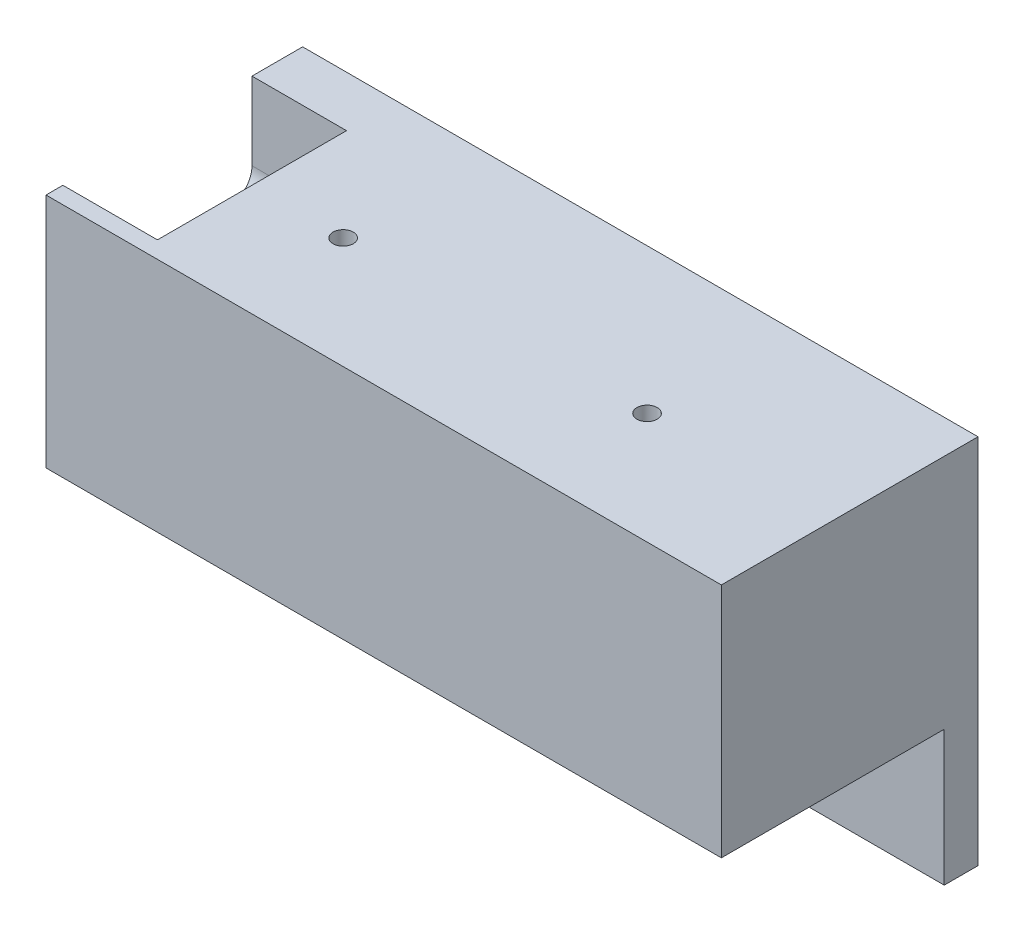
ISO-10303-21;
HEADER;
FILE_DESCRIPTION(('STEP AP214'),'2;1');
FILE_NAME('part.step','',(''),(''),'','','');
FILE_SCHEMA(('AUTOMOTIVE_DESIGN { 1 0 10303 214 1 1 1 1 }'));
ENDSEC;
DATA;
#1=APPLICATION_CONTEXT('core data for automotive mechanical design processes');
#2=APPLICATION_PROTOCOL_DEFINITION('international standard','automotive_design',2000,#1);
#3=PRODUCT_CONTEXT('',#1,'mechanical');
#4=PRODUCT('Part','Part','',(#3));
#5=PRODUCT_RELATED_PRODUCT_CATEGORY('part','',(#4));
#6=PRODUCT_DEFINITION_FORMATION('','',#4);
#7=PRODUCT_DEFINITION_CONTEXT('part definition',#1,'design');
#8=PRODUCT_DEFINITION('design','',#6,#7);
#9=PRODUCT_DEFINITION_SHAPE('','',#8);
#10=(LENGTH_UNIT() NAMED_UNIT(*) SI_UNIT(.MILLI.,.METRE.));
#11=(NAMED_UNIT(*) PLANE_ANGLE_UNIT() SI_UNIT($,.RADIAN.));
#12=(NAMED_UNIT(*) SI_UNIT($,.STERADIAN.) SOLID_ANGLE_UNIT());
#13=UNCERTAINTY_MEASURE_WITH_UNIT(LENGTH_MEASURE(1.E-05),#10,'distance_accuracy_value','');
#14=(GEOMETRIC_REPRESENTATION_CONTEXT(3) GLOBAL_UNCERTAINTY_ASSIGNED_CONTEXT((#13)) GLOBAL_UNIT_ASSIGNED_CONTEXT((#10,
#11,#12)) REPRESENTATION_CONTEXT('',''));
#15=CARTESIAN_POINT('',(0.,0.,0.));
#16=DIRECTION('',(0.,0.,1.));
#17=DIRECTION('',(1.,0.,0.));
#18=AXIS2_PLACEMENT_3D('',#15,#16,#17);
#19=CARTESIAN_POINT('',(0.,22.5,0.));
#20=DIRECTION('',(0.,-1.,0.));
#21=DIRECTION('',(0.,0.,-1.));
#22=AXIS2_PLACEMENT_3D('',#19,#20,#21);
#23=PLANE('',#22);
#24=CARTESIAN_POINT('',(-22.5,22.5,21.5));
#25=DIRECTION('',(0.,-1.,0.));
#26=DIRECTION('',(0.,0.,-1.));
#27=AXIS2_PLACEMENT_3D('',#24,#25,#26);
#28=CIRCLE('',#27,1.5);
#29=CARTESIAN_POINT('',(-22.5,22.5,20.));
#30=VERTEX_POINT('',#29);
#31=EDGE_CURVE('E203',#30,#30,#28,.T.);
#32=ORIENTED_EDGE('',*,*,#31,.F.);
#33=EDGE_LOOP('',(#32));
#34=FACE_BOUND('',#33,.T.);
#35=CARTESIAN_POINT('',(22.5,22.5,21.5));
#36=DIRECTION('',(0.,-1.,0.));
#37=DIRECTION('',(0.,0.,-1.));
#38=AXIS2_PLACEMENT_3D('',#35,#36,#37);
#39=CIRCLE('',#38,1.5);
#40=CARTESIAN_POINT('',(22.5,22.5,20.));
#41=VERTEX_POINT('',#40);
#42=EDGE_CURVE('E193',#41,#41,#39,.T.);
#43=ORIENTED_EDGE('',*,*,#42,.F.);
#44=EDGE_LOOP('',(#43));
#45=FACE_BOUND('',#44,.T.);
#46=DIRECTION('',(-1.,0.,0.));
#47=VECTOR('',#46,1.);
#48=CARTESIAN_POINT('',(-46.,22.5,35.5));
#49=LINE('',#48,#47);
#50=CARTESIAN_POINT('',(42.5,22.5,35.5));
#51=VERTEX_POINT('',#50);
#52=CARTESIAN_POINT('',(-36.,22.5,35.5));
#53=VERTEX_POINT('',#52);
#54=EDGE_CURVE('E216',#51,#53,#49,.T.);
#55=ORIENTED_EDGE('',*,*,#54,.T.);
#56=DIRECTION('',(0.,0.,-1.));
#57=VECTOR('',#56,1.);
#58=CARTESIAN_POINT('',(-36.,22.5,0.));
#59=LINE('',#58,#57);
#60=CARTESIAN_POINT('',(-36.,22.5,7.50000000000001));
#61=VERTEX_POINT('',#60);
#62=EDGE_CURVE('E314',#53,#61,#59,.T.);
#63=ORIENTED_EDGE('',*,*,#62,.T.);
#64=DIRECTION('',(1.,0.,0.));
#65=VECTOR('',#64,1.);
#66=CARTESIAN_POINT('',(-46.,22.5,7.50000000000001));
#67=LINE('',#66,#65);
#68=CARTESIAN_POINT('',(42.5,22.5,7.49999999999999));
#69=VERTEX_POINT('',#68);
#70=EDGE_CURVE('E170',#61,#69,#67,.T.);
#71=ORIENTED_EDGE('',*,*,#70,.T.);
#72=CARTESIAN_POINT('',(42.5,22.5,11.));
#73=DIRECTION('',(0.,-1.,0.));
#74=DIRECTION('',(0.,0.,-1.));
#75=AXIS2_PLACEMENT_3D('',#72,#73,#74);
#76=CIRCLE('',#75,3.5);
#77=CARTESIAN_POINT('',(46.,22.5,11.));
#78=VERTEX_POINT('',#77);
#79=EDGE_CURVE('E294',#69,#78,#76,.T.);
#80=ORIENTED_EDGE('',*,*,#79,.T.);
#81=DIRECTION('',(0.,0.,1.));
#82=VECTOR('',#81,1.);
#83=CARTESIAN_POINT('',(46.,22.5,35.5));
#84=LINE('',#83,#82);
#85=CARTESIAN_POINT('',(46.,22.5,32.));
#86=VERTEX_POINT('',#85);
#87=EDGE_CURVE('E212',#78,#86,#84,.T.);
#88=ORIENTED_EDGE('',*,*,#87,.T.);
#89=CARTESIAN_POINT('',(42.5,22.5,32.));
#90=DIRECTION('',(0.,-1.,0.));
#91=DIRECTION('',(0.,0.,-1.));
#92=AXIS2_PLACEMENT_3D('',#89,#90,#91);
#93=CIRCLE('',#92,3.5);
#94=EDGE_CURVE('E296',#86,#51,#93,.T.);
#95=ORIENTED_EDGE('',*,*,#94,.T.);
#96=EDGE_LOOP('',(#55,#63,#71,#80,#88,#95));
#97=FACE_BOUND('',#96,.T.);
#98=ADVANCED_FACE('F35',(#34,#45,#97),#23,.T.);
#99=CARTESIAN_POINT('',(-50.,27.5,38.));
#100=DIRECTION('',(1.,0.,0.));
#101=DIRECTION('',(0.,0.,-1.));
#102=AXIS2_PLACEMENT_3D('',#99,#100,#101);
#103=PLANE('',#102);
#104=DIRECTION('',(0.,0.,1.));
#105=VECTOR('',#104,1.);
#106=CARTESIAN_POINT('',(-50.,12.5,7.50000000000001));
#107=LINE('',#106,#105);
#108=CARTESIAN_POINT('',(-50.,12.5,11.));
#109=VERTEX_POINT('',#108);
#110=CARTESIAN_POINT('',(-50.,12.5,32.));
#111=VERTEX_POINT('',#110);
#112=EDGE_CURVE('E347',#109,#111,#107,.T.);
#113=ORIENTED_EDGE('',*,*,#112,.F.);
#114=CARTESIAN_POINT('',(-50.,16.,11.));
#115=DIRECTION('',(1.,0.,0.));
#116=DIRECTION('',(0.,0.,-1.));
#117=AXIS2_PLACEMENT_3D('',#114,#115,#116);
#118=CIRCLE('',#117,3.5);
#119=CARTESIAN_POINT('',(-50.,16.,7.50000000000001));
#120=VERTEX_POINT('',#119);
#121=EDGE_CURVE('E43',#109,#120,#118,.T.);
#122=ORIENTED_EDGE('',*,*,#121,.T.);
#123=DIRECTION('',(0.,-1.,0.));
#124=VECTOR('',#123,1.);
#125=CARTESIAN_POINT('',(-50.,27.5,7.50000000000001));
#126=LINE('',#125,#124);
#127=CARTESIAN_POINT('',(-50.,27.5,7.50000000000001));
#128=VERTEX_POINT('',#127);
#129=EDGE_CURVE('E348',#128,#120,#126,.T.);
#130=ORIENTED_EDGE('',*,*,#129,.F.);
#131=DIRECTION('',(0.,0.,-1.));
#132=VECTOR('',#131,1.);
#133=CARTESIAN_POINT('',(-50.,27.5,38.));
#134=LINE('',#133,#132);
#135=CARTESIAN_POINT('',(-50.,27.5,0.));
#136=VERTEX_POINT('',#135);
#137=EDGE_CURVE('E189',#128,#136,#134,.T.);
#138=ORIENTED_EDGE('',*,*,#137,.T.);
#139=DIRECTION('',(0.,-1.,0.));
#140=VECTOR('',#139,1.);
#141=CARTESIAN_POINT('',(-50.,27.5,0.));
#142=LINE('',#141,#140);
#143=CARTESIAN_POINT('',(-50.,-27.5,0.));
#144=VERTEX_POINT('',#143);
#145=EDGE_CURVE('E256',#136,#144,#142,.T.);
#146=ORIENTED_EDGE('',*,*,#145,.T.);
#147=DIRECTION('',(0.,0.,-1.));
#148=VECTOR('',#147,1.);
#149=CARTESIAN_POINT('',(-50.,-27.5,38.));
#150=LINE('',#149,#148);
#151=CARTESIAN_POINT('',(-50.,-27.5,5.));
#152=VERTEX_POINT('',#151);
#153=EDGE_CURVE('E282',#152,#144,#150,.T.);
#154=ORIENTED_EDGE('',*,*,#153,.F.);
#155=DIRECTION('',(0.,-1.,0.));
#156=VECTOR('',#155,1.);
#157=CARTESIAN_POINT('',(-50.,-27.5,5.));
#158=LINE('',#157,#156);
#159=CARTESIAN_POINT('',(-50.,-7.5,5.));
#160=VERTEX_POINT('',#159);
#161=EDGE_CURVE('E242',#160,#152,#158,.T.);
#162=ORIENTED_EDGE('',*,*,#161,.F.);
#163=DIRECTION('',(0.,0.,1.));
#164=VECTOR('',#163,1.);
#165=CARTESIAN_POINT('',(-50.,-7.5,5.));
#166=LINE('',#165,#164);
#167=CARTESIAN_POINT('',(-50.,-7.5,38.));
#168=VERTEX_POINT('',#167);
#169=EDGE_CURVE('E253',#160,#168,#166,.T.);
#170=ORIENTED_EDGE('',*,*,#169,.T.);
#171=DIRECTION('',(0.,-1.,0.));
#172=VECTOR('',#171,1.);
#173=CARTESIAN_POINT('',(-50.,27.5,38.));
#174=LINE('',#173,#172);
#175=CARTESIAN_POINT('',(-50.,27.5,38.));
#176=VERTEX_POINT('',#175);
#177=EDGE_CURVE('E258',#176,#168,#174,.T.);
#178=ORIENTED_EDGE('',*,*,#177,.F.);
#179=CARTESIAN_POINT('',(-50.,27.5,35.5));
#180=VERTEX_POINT('',#179);
#181=EDGE_CURVE('E274',#176,#180,#134,.T.);
#182=ORIENTED_EDGE('',*,*,#181,.T.);
#183=DIRECTION('',(0.,1.,0.));
#184=VECTOR('',#183,1.);
#185=CARTESIAN_POINT('',(-50.,27.5,35.5));
#186=LINE('',#185,#184);
#187=CARTESIAN_POINT('',(-50.,16.,35.5));
#188=VERTEX_POINT('',#187);
#189=EDGE_CURVE('E174',#188,#180,#186,.T.);
#190=ORIENTED_EDGE('',*,*,#189,.F.);
#191=CARTESIAN_POINT('',(-50.,16.,32.));
#192=DIRECTION('',(1.,0.,0.));
#193=DIRECTION('',(0.,0.,-1.));
#194=AXIS2_PLACEMENT_3D('',#191,#192,#193);
#195=CIRCLE('',#194,3.5);
#196=EDGE_CURVE('E326',#188,#111,#195,.T.);
#197=ORIENTED_EDGE('',*,*,#196,.T.);
#198=EDGE_LOOP('',(#113,#122,#130,#138,#146,#154,#162,#170,#178,#182,#190,#197));
#199=FACE_BOUND('',#198,.T.);
#200=ADVANCED_FACE('F343',(#199),#103,.F.);
#201=CARTESIAN_POINT('',(-50.,-27.5,38.));
#202=DIRECTION('',(0.,1.,0.));
#203=DIRECTION('',(-1.,0.,0.));
#204=AXIS2_PLACEMENT_3D('',#201,#202,#203);
#205=PLANE('',#204);
#206=DIRECTION('',(0.,0.,-1.));
#207=VECTOR('',#206,1.);
#208=CARTESIAN_POINT('',(50.,-27.5,38.));
#209=LINE('',#208,#207);
#210=CARTESIAN_POINT('',(50.,-27.5,5.));
#211=VERTEX_POINT('',#210);
#212=CARTESIAN_POINT('',(50.,-27.5,0.));
#213=VERTEX_POINT('',#212);
#214=EDGE_CURVE('E280',#211,#213,#209,.T.);
#215=ORIENTED_EDGE('',*,*,#214,.F.);
#216=DIRECTION('',(1.,0.,0.));
#217=VECTOR('',#216,1.);
#218=CARTESIAN_POINT('',(-50.,-27.5,5.));
#219=LINE('',#218,#217);
#220=EDGE_CURVE('E244',#152,#211,#219,.T.);
#221=ORIENTED_EDGE('',*,*,#220,.F.);
#222=ORIENTED_EDGE('',*,*,#153,.T.);
#223=DIRECTION('',(1.,0.,0.));
#224=VECTOR('',#223,1.);
#225=CARTESIAN_POINT('',(-50.,-27.5,0.));
#226=LINE('',#225,#224);
#227=EDGE_CURVE('E268',#144,#213,#226,.T.);
#228=ORIENTED_EDGE('',*,*,#227,.T.);
#229=EDGE_LOOP('',(#215,#221,#222,#228));
#230=FACE_BOUND('',#229,.T.);
#231=ADVANCED_FACE('F404',(#230),#205,.F.);
#232=CARTESIAN_POINT('',(50.,27.5,38.));
#233=DIRECTION('',(-1.,0.,0.));
#234=DIRECTION('',(0.,0.,1.));
#235=AXIS2_PLACEMENT_3D('',#232,#233,#234);
#236=PLANE('',#235);
#237=DIRECTION('',(0.,1.,0.));
#238=VECTOR('',#237,1.);
#239=CARTESIAN_POINT('',(50.,27.5,38.));
#240=LINE('',#239,#238);
#241=CARTESIAN_POINT('',(50.,-7.5,38.));
#242=VERTEX_POINT('',#241);
#243=CARTESIAN_POINT('',(50.,27.5,38.));
#244=VERTEX_POINT('',#243);
#245=EDGE_CURVE('E261',#242,#244,#240,.T.);
#246=ORIENTED_EDGE('',*,*,#245,.F.);
#247=DIRECTION('',(0.,0.,1.));
#248=VECTOR('',#247,1.);
#249=CARTESIAN_POINT('',(50.,-7.5,5.));
#250=LINE('',#249,#248);
#251=CARTESIAN_POINT('',(50.,-7.5,5.));
#252=VERTEX_POINT('',#251);
#253=EDGE_CURVE('E251',#252,#242,#250,.T.);
#254=ORIENTED_EDGE('',*,*,#253,.F.);
#255=DIRECTION('',(0.,1.,0.));
#256=VECTOR('',#255,1.);
#257=CARTESIAN_POINT('',(50.,-27.5,5.));
#258=LINE('',#257,#256);
#259=EDGE_CURVE('E246',#211,#252,#258,.T.);
#260=ORIENTED_EDGE('',*,*,#259,.F.);
#261=ORIENTED_EDGE('',*,*,#214,.T.);
#262=DIRECTION('',(0.,1.,0.));
#263=VECTOR('',#262,1.);
#264=CARTESIAN_POINT('',(50.,27.5,0.));
#265=LINE('',#264,#263);
#266=CARTESIAN_POINT('',(50.,27.5,0.));
#267=VERTEX_POINT('',#266);
#268=EDGE_CURVE('E271',#213,#267,#265,.T.);
#269=ORIENTED_EDGE('',*,*,#268,.T.);
#270=DIRECTION('',(0.,0.,-1.));
#271=VECTOR('',#270,1.);
#272=CARTESIAN_POINT('',(50.,27.5,38.));
#273=LINE('',#272,#271);
#274=EDGE_CURVE('E277',#244,#267,#273,.T.);
#275=ORIENTED_EDGE('',*,*,#274,.F.);
#276=EDGE_LOOP('',(#246,#254,#260,#261,#269,#275));
#277=FACE_BOUND('',#276,.T.);
#278=ADVANCED_FACE('F393',(#277),#236,.F.);
#279=CARTESIAN_POINT('',(-50.,27.5,38.));
#280=DIRECTION('',(0.,-1.,0.));
#281=DIRECTION('',(0.,0.,-1.));
#282=AXIS2_PLACEMENT_3D('',#279,#280,#281);
#283=PLANE('',#282);
#284=ORIENTED_EDGE('',*,*,#137,.F.);
#285=DIRECTION('',(-1.,0.,0.));
#286=VECTOR('',#285,1.);
#287=CARTESIAN_POINT('',(-36.,27.5,7.50000000000001));
#288=LINE('',#287,#286);
#289=CARTESIAN_POINT('',(-36.,27.5,7.50000000000001));
#290=VERTEX_POINT('',#289);
#291=EDGE_CURVE('E168',#290,#128,#288,.T.);
#292=ORIENTED_EDGE('',*,*,#291,.F.);
#293=DIRECTION('',(0.,0.,-1.));
#294=VECTOR('',#293,1.);
#295=CARTESIAN_POINT('',(-36.,27.5,7.50000000000001));
#296=LINE('',#295,#294);
#297=CARTESIAN_POINT('',(-36.,27.5,35.5));
#298=VERTEX_POINT('',#297);
#299=EDGE_CURVE('E178',#298,#290,#296,.T.);
#300=ORIENTED_EDGE('',*,*,#299,.F.);
#301=DIRECTION('',(-1.,0.,0.));
#302=VECTOR('',#301,1.);
#303=CARTESIAN_POINT('',(-36.,27.5,35.5));
#304=LINE('',#303,#302);
#305=EDGE_CURVE('E183',#298,#180,#304,.T.);
#306=ORIENTED_EDGE('',*,*,#305,.T.);
#307=ORIENTED_EDGE('',*,*,#181,.F.);
#308=DIRECTION('',(-1.,0.,0.));
#309=VECTOR('',#308,1.);
#310=CARTESIAN_POINT('',(-50.,27.5,38.));
#311=LINE('',#310,#309);
#312=EDGE_CURVE('E264',#244,#176,#311,.T.);
#313=ORIENTED_EDGE('',*,*,#312,.F.);
#314=ORIENTED_EDGE('',*,*,#274,.T.);
#315=DIRECTION('',(-1.,0.,0.));
#316=VECTOR('',#315,1.);
#317=CARTESIAN_POINT('',(-50.,27.5,0.));
#318=LINE('',#317,#316);
#319=EDGE_CURVE('E262',#267,#136,#318,.T.);
#320=ORIENTED_EDGE('',*,*,#319,.T.);
#321=EDGE_LOOP('',(#284,#292,#300,#306,#307,#313,#314,#320));
#322=FACE_BOUND('',#321,.T.);
#323=CARTESIAN_POINT('',(-22.5,27.5,21.5));
#324=DIRECTION('',(0.,-1.,0.));
#325=DIRECTION('',(0.,0.,-1.));
#326=AXIS2_PLACEMENT_3D('',#323,#324,#325);
#327=CIRCLE('',#326,1.5);
#328=CARTESIAN_POINT('',(-22.5,27.5,20.));
#329=VERTEX_POINT('',#328);
#330=EDGE_CURVE('E199',#329,#329,#327,.T.);
#331=ORIENTED_EDGE('',*,*,#330,.T.);
#332=EDGE_LOOP('',(#331));
#333=FACE_BOUND('',#332,.T.);
#334=CARTESIAN_POINT('',(22.5,27.5,21.5));
#335=DIRECTION('',(0.,-1.,0.));
#336=DIRECTION('',(0.,0.,-1.));
#337=AXIS2_PLACEMENT_3D('',#334,#335,#336);
#338=CIRCLE('',#337,1.5);
#339=CARTESIAN_POINT('',(22.5,27.5,20.));
#340=VERTEX_POINT('',#339);
#341=EDGE_CURVE('E206',#340,#340,#338,.T.);
#342=ORIENTED_EDGE('',*,*,#341,.T.);
#343=EDGE_LOOP('',(#342));
#344=FACE_BOUND('',#343,.T.);
#345=ADVANCED_FACE('F186',(#322,#333,#344),#283,.F.);
#346=CARTESIAN_POINT('',(0.,0.,38.));
#347=DIRECTION('',(0.,0.,1.));
#348=DIRECTION('',(1.,0.,0.));
#349=AXIS2_PLACEMENT_3D('',#346,#347,#348);
#350=PLANE('',#349);
#351=DIRECTION('',(-1.,0.,0.));
#352=VECTOR('',#351,1.);
#353=CARTESIAN_POINT('',(-50.,-7.5,38.));
#354=LINE('',#353,#352);
#355=EDGE_CURVE('E233',#242,#168,#354,.T.);
#356=ORIENTED_EDGE('',*,*,#355,.F.);
#357=ORIENTED_EDGE('',*,*,#245,.T.);
#358=ORIENTED_EDGE('',*,*,#312,.T.);
#359=ORIENTED_EDGE('',*,*,#177,.T.);
#360=EDGE_LOOP('',(#356,#357,#358,#359));
#361=FACE_BOUND('',#360,.T.);
#362=ADVANCED_FACE('F388',(#361),#350,.T.);
#363=CARTESIAN_POINT('',(0.,0.,0.));
#364=DIRECTION('',(0.,0.,1.));
#365=DIRECTION('',(1.,0.,0.));
#366=AXIS2_PLACEMENT_3D('',#363,#364,#365);
#367=PLANE('',#366);
#368=CARTESIAN_POINT('',(-10.,-19.5,0.));
#369=DIRECTION('',(0.,0.,1.));
#370=DIRECTION('',(1.,0.,0.));
#371=AXIS2_PLACEMENT_3D('',#368,#369,#370);
#372=CIRCLE('',#371,1.5);
#373=CARTESIAN_POINT('',(-8.49999999999999,-19.5,0.));
#374=VERTEX_POINT('',#373);
#375=EDGE_CURVE('E230',#374,#374,#372,.T.);
#376=ORIENTED_EDGE('',*,*,#375,.T.);
#377=EDGE_LOOP('',(#376));
#378=FACE_BOUND('',#377,.T.);
#379=CARTESIAN_POINT('',(10.,-19.5,0.));
#380=DIRECTION('',(0.,0.,1.));
#381=DIRECTION('',(1.,0.,0.));
#382=AXIS2_PLACEMENT_3D('',#379,#380,#381);
#383=CIRCLE('',#382,1.5);
#384=CARTESIAN_POINT('',(11.5,-19.5,0.));
#385=VERTEX_POINT('',#384);
#386=EDGE_CURVE('E237',#385,#385,#383,.T.);
#387=ORIENTED_EDGE('',*,*,#386,.T.);
#388=EDGE_LOOP('',(#387));
#389=FACE_BOUND('',#388,.T.);
#390=ORIENTED_EDGE('',*,*,#145,.F.);
#391=ORIENTED_EDGE('',*,*,#319,.F.);
#392=ORIENTED_EDGE('',*,*,#268,.F.);
#393=ORIENTED_EDGE('',*,*,#227,.F.);
#394=EDGE_LOOP('',(#390,#391,#392,#393));
#395=FACE_BOUND('',#394,.T.);
#396=ADVANCED_FACE('F398',(#378,#389,#395),#367,.F.);
#397=CARTESIAN_POINT('',(-50.,-7.5,5.));
#398=DIRECTION('',(0.,1.,0.));
#399=DIRECTION('',(0.,0.,1.));
#400=AXIS2_PLACEMENT_3D('',#397,#398,#399);
#401=PLANE('',#400);
#402=DIRECTION('',(1.,0.,0.));
#403=VECTOR('',#402,1.);
#404=CARTESIAN_POINT('',(-46.,-7.5,7.50000000000001));
#405=LINE('',#404,#403);
#406=CARTESIAN_POINT('',(-42.5,-7.5,7.50000000000001));
#407=VERTEX_POINT('',#406);
#408=CARTESIAN_POINT('',(42.5,-7.5,7.49999999999999));
#409=VERTEX_POINT('',#408);
#410=EDGE_CURVE('E222',#407,#409,#405,.T.);
#411=ORIENTED_EDGE('',*,*,#410,.F.);
#412=CARTESIAN_POINT('',(-42.5,-7.5,11.));
#413=DIRECTION('',(0.,1.,0.));
#414=DIRECTION('',(0.,0.,1.));
#415=AXIS2_PLACEMENT_3D('',#412,#413,#414);
#416=CIRCLE('',#415,3.5);
#417=CARTESIAN_POINT('',(-46.,-7.5,11.));
#418=VERTEX_POINT('',#417);
#419=EDGE_CURVE('E312',#407,#418,#416,.T.);
#420=ORIENTED_EDGE('',*,*,#419,.T.);
#421=DIRECTION('',(0.,0.,-1.));
#422=VECTOR('',#421,1.);
#423=CARTESIAN_POINT('',(-46.,-7.5,35.5));
#424=LINE('',#423,#422);
#425=CARTESIAN_POINT('',(-46.,-7.5,32.));
#426=VERTEX_POINT('',#425);
#427=EDGE_CURVE('E202',#426,#418,#424,.T.);
#428=ORIENTED_EDGE('',*,*,#427,.F.);
#429=CARTESIAN_POINT('',(-42.5,-7.5,32.));
#430=DIRECTION('',(0.,1.,0.));
#431=DIRECTION('',(0.,0.,1.));
#432=AXIS2_PLACEMENT_3D('',#429,#430,#431);
#433=CIRCLE('',#432,3.5);
#434=CARTESIAN_POINT('',(-42.5,-7.5,35.5));
#435=VERTEX_POINT('',#434);
#436=EDGE_CURVE('E306',#426,#435,#433,.T.);
#437=ORIENTED_EDGE('',*,*,#436,.T.);
#438=DIRECTION('',(-1.,0.,0.));
#439=VECTOR('',#438,1.);
#440=CARTESIAN_POINT('',(-46.,-7.5,35.5));
#441=LINE('',#440,#439);
#442=CARTESIAN_POINT('',(42.5,-7.5,35.5));
#443=VERTEX_POINT('',#442);
#444=EDGE_CURVE('E213',#443,#435,#441,.T.);
#445=ORIENTED_EDGE('',*,*,#444,.F.);
#446=CARTESIAN_POINT('',(42.5,-7.5,32.));
#447=DIRECTION('',(0.,1.,0.));
#448=DIRECTION('',(0.,0.,1.));
#449=AXIS2_PLACEMENT_3D('',#446,#447,#448);
#450=CIRCLE('',#449,3.5);
#451=CARTESIAN_POINT('',(46.,-7.5,32.));
#452=VERTEX_POINT('',#451);
#453=EDGE_CURVE('E308',#443,#452,#450,.T.);
#454=ORIENTED_EDGE('',*,*,#453,.T.);
#455=DIRECTION('',(0.,0.,1.));
#456=VECTOR('',#455,1.);
#457=CARTESIAN_POINT('',(46.,-7.5,35.5));
#458=LINE('',#457,#456);
#459=CARTESIAN_POINT('',(46.,-7.5,11.));
#460=VERTEX_POINT('',#459);
#461=EDGE_CURVE('E225',#460,#452,#458,.T.);
#462=ORIENTED_EDGE('',*,*,#461,.F.);
#463=CARTESIAN_POINT('',(42.5,-7.5,11.));
#464=DIRECTION('',(0.,1.,0.));
#465=DIRECTION('',(0.,0.,1.));
#466=AXIS2_PLACEMENT_3D('',#463,#464,#465);
#467=CIRCLE('',#466,3.5);
#468=EDGE_CURVE('E310',#460,#409,#467,.T.);
#469=ORIENTED_EDGE('',*,*,#468,.T.);
#470=EDGE_LOOP('',(#411,#420,#428,#437,#445,#454,#462,#469));
#471=FACE_BOUND('',#470,.T.);
#472=ORIENTED_EDGE('',*,*,#355,.T.);
#473=ORIENTED_EDGE('',*,*,#169,.F.);
#474=DIRECTION('',(-1.,0.,0.));
#475=VECTOR('',#474,1.);
#476=CARTESIAN_POINT('',(-50.,-7.5,5.));
#477=LINE('',#476,#475);
#478=EDGE_CURVE('E248',#252,#160,#477,.T.);
#479=ORIENTED_EDGE('',*,*,#478,.F.);
#480=ORIENTED_EDGE('',*,*,#253,.T.);
#481=EDGE_LOOP('',(#472,#473,#479,#480));
#482=FACE_BOUND('',#481,.T.);
#483=ADVANCED_FACE('F365',(#471,#482),#401,.F.);
#484=CARTESIAN_POINT('',(0.,0.,5.));
#485=DIRECTION('',(0.,0.,-1.));
#486=DIRECTION('',(-1.,0.,0.));
#487=AXIS2_PLACEMENT_3D('',#484,#485,#486);
#488=PLANE('',#487);
#489=CARTESIAN_POINT('',(-10.,-19.5,5.));
#490=DIRECTION('',(0.,0.,1.));
#491=DIRECTION('',(1.,0.,0.));
#492=AXIS2_PLACEMENT_3D('',#489,#490,#491);
#493=CIRCLE('',#492,1.5);
#494=CARTESIAN_POINT('',(-8.49999999999999,-19.5,5.));
#495=VERTEX_POINT('',#494);
#496=EDGE_CURVE('E234',#495,#495,#493,.T.);
#497=ORIENTED_EDGE('',*,*,#496,.F.);
#498=EDGE_LOOP('',(#497));
#499=FACE_BOUND('',#498,.T.);
#500=CARTESIAN_POINT('',(10.,-19.5,5.));
#501=DIRECTION('',(0.,0.,1.));
#502=DIRECTION('',(1.,0.,0.));
#503=AXIS2_PLACEMENT_3D('',#500,#501,#502);
#504=CIRCLE('',#503,1.5);
#505=CARTESIAN_POINT('',(11.5,-19.5,5.));
#506=VERTEX_POINT('',#505);
#507=EDGE_CURVE('E219',#506,#506,#504,.T.);
#508=ORIENTED_EDGE('',*,*,#507,.F.);
#509=EDGE_LOOP('',(#508));
#510=FACE_BOUND('',#509,.T.);
#511=ORIENTED_EDGE('',*,*,#161,.T.);
#512=ORIENTED_EDGE('',*,*,#220,.T.);
#513=ORIENTED_EDGE('',*,*,#259,.T.);
#514=ORIENTED_EDGE('',*,*,#478,.T.);
#515=EDGE_LOOP('',(#511,#512,#513,#514));
#516=FACE_BOUND('',#515,.T.);
#517=ADVANCED_FACE('F407',(#499,#510,#516),#488,.F.);
#518=CARTESIAN_POINT('',(10.,-19.5,0.));
#519=DIRECTION('',(0.,0.,1.));
#520=DIRECTION('',(1.,0.,0.));
#521=AXIS2_PLACEMENT_3D('',#518,#519,#520);
#522=CYLINDRICAL_SURFACE('',#521,1.5);
#523=ORIENTED_EDGE('',*,*,#386,.F.);
#524=EDGE_LOOP('',(#523));
#525=FACE_BOUND('',#524,.T.);
#526=ORIENTED_EDGE('',*,*,#507,.T.);
#527=EDGE_LOOP('',(#526));
#528=FACE_BOUND('',#527,.T.);
#529=ADVANCED_FACE('F415',(#525,#528),#522,.F.);
#530=CARTESIAN_POINT('',(-10.,-19.5,0.));
#531=DIRECTION('',(0.,0.,1.));
#532=DIRECTION('',(1.,0.,0.));
#533=AXIS2_PLACEMENT_3D('',#530,#531,#532);
#534=CYLINDRICAL_SURFACE('',#533,1.5);
#535=ORIENTED_EDGE('',*,*,#375,.F.);
#536=EDGE_LOOP('',(#535));
#537=FACE_BOUND('',#536,.T.);
#538=ORIENTED_EDGE('',*,*,#496,.T.);
#539=EDGE_LOOP('',(#538));
#540=FACE_BOUND('',#539,.T.);
#541=ADVANCED_FACE('F442',(#537,#540),#534,.F.);
#542=CARTESIAN_POINT('',(-46.,22.5,35.5));
#543=DIRECTION('',(-1.,0.,0.));
#544=DIRECTION('',(0.,0.,1.));
#545=AXIS2_PLACEMENT_3D('',#542,#543,#544);
#546=PLANE('',#545);
#547=DIRECTION('',(0.,-1.,0.));
#548=VECTOR('',#547,1.);
#549=CARTESIAN_POINT('',(-46.,22.5,11.));
#550=LINE('',#549,#548);
#551=CARTESIAN_POINT('',(-46.,12.5,11.));
#552=VERTEX_POINT('',#551);
#553=EDGE_CURVE('E284',#418,#552,#550,.F.);
#554=ORIENTED_EDGE('',*,*,#553,.T.);
#555=DIRECTION('',(0.,0.,1.));
#556=VECTOR('',#555,1.);
#557=CARTESIAN_POINT('',(-46.,12.5,35.5));
#558=LINE('',#557,#556);
#559=CARTESIAN_POINT('',(-46.,12.5,32.));
#560=VERTEX_POINT('',#559);
#561=EDGE_CURVE('E190',#552,#560,#558,.T.);
#562=ORIENTED_EDGE('',*,*,#561,.T.);
#563=DIRECTION('',(0.,-1.,0.));
#564=VECTOR('',#563,1.);
#565=CARTESIAN_POINT('',(-46.,-7.5,32.));
#566=LINE('',#565,#564);
#567=EDGE_CURVE('E287',#560,#426,#566,.T.);
#568=ORIENTED_EDGE('',*,*,#567,.T.);
#569=ORIENTED_EDGE('',*,*,#427,.T.);
#570=EDGE_LOOP('',(#554,#562,#568,#569));
#571=FACE_BOUND('',#570,.T.);
#572=ADVANCED_FACE('F361',(#571),#546,.F.);
#573=CARTESIAN_POINT('',(-46.,22.5,35.5));
#574=DIRECTION('',(0.,0.,1.));
#575=DIRECTION('',(1.,0.,0.));
#576=AXIS2_PLACEMENT_3D('',#573,#574,#575);
#577=PLANE('',#576);
#578=DIRECTION('',(0.,-1.,0.));
#579=VECTOR('',#578,1.);
#580=CARTESIAN_POINT('',(-42.5,22.5,35.5));
#581=LINE('',#580,#579);
#582=CARTESIAN_POINT('',(-42.5,16.,35.5));
#583=VERTEX_POINT('',#582);
#584=EDGE_CURVE('E292',#435,#583,#581,.F.);
#585=ORIENTED_EDGE('',*,*,#584,.T.);
#586=DIRECTION('',(-1.,0.,0.));
#587=VECTOR('',#586,1.);
#588=CARTESIAN_POINT('',(-50.,16.,35.5));
#589=LINE('',#588,#587);
#590=EDGE_CURVE('E316',#583,#188,#589,.T.);
#591=ORIENTED_EDGE('',*,*,#590,.T.);
#592=ORIENTED_EDGE('',*,*,#189,.T.);
#593=ORIENTED_EDGE('',*,*,#305,.F.);
#594=DIRECTION('',(0.,1.,0.));
#595=VECTOR('',#594,1.);
#596=CARTESIAN_POINT('',(-36.,27.5,35.5));
#597=LINE('',#596,#595);
#598=EDGE_CURVE('E173',#53,#298,#597,.T.);
#599=ORIENTED_EDGE('',*,*,#598,.F.);
#600=ORIENTED_EDGE('',*,*,#54,.F.);
#601=DIRECTION('',(0.,-1.,0.));
#602=VECTOR('',#601,1.);
#603=CARTESIAN_POINT('',(42.5,-7.5,35.5));
#604=LINE('',#603,#602);
#605=EDGE_CURVE('E289',#51,#443,#604,.T.);
#606=ORIENTED_EDGE('',*,*,#605,.T.);
#607=ORIENTED_EDGE('',*,*,#444,.T.);
#608=EDGE_LOOP('',(#585,#591,#592,#593,#599,#600,#606,#607));
#609=FACE_BOUND('',#608,.T.);
#610=ADVANCED_FACE('F342',(#609),#577,.F.);
#611=CARTESIAN_POINT('',(46.,22.5,35.5));
#612=DIRECTION('',(1.,0.,0.));
#613=DIRECTION('',(0.,0.,-1.));
#614=AXIS2_PLACEMENT_3D('',#611,#612,#613);
#615=PLANE('',#614);
#616=ORIENTED_EDGE('',*,*,#461,.T.);
#617=DIRECTION('',(0.,-1.,0.));
#618=VECTOR('',#617,1.);
#619=CARTESIAN_POINT('',(46.,22.5,32.));
#620=LINE('',#619,#618);
#621=EDGE_CURVE('E301',#452,#86,#620,.F.);
#622=ORIENTED_EDGE('',*,*,#621,.T.);
#623=ORIENTED_EDGE('',*,*,#87,.F.);
#624=DIRECTION('',(0.,-1.,0.));
#625=VECTOR('',#624,1.);
#626=CARTESIAN_POINT('',(46.,-7.5,11.));
#627=LINE('',#626,#625);
#628=EDGE_CURVE('E298',#78,#460,#627,.T.);
#629=ORIENTED_EDGE('',*,*,#628,.T.);
#630=EDGE_LOOP('',(#616,#622,#623,#629));
#631=FACE_BOUND('',#630,.T.);
#632=ADVANCED_FACE('F378',(#631),#615,.F.);
#633=CARTESIAN_POINT('',(-46.,22.5,7.50000000000001));
#634=DIRECTION('',(0.,0.,-1.));
#635=DIRECTION('',(-1.,0.,0.));
#636=AXIS2_PLACEMENT_3D('',#633,#634,#635);
#637=PLANE('',#636);
#638=ORIENTED_EDGE('',*,*,#129,.T.);
#639=DIRECTION('',(-1.,0.,0.));
#640=VECTOR('',#639,1.);
#641=CARTESIAN_POINT('',(-42.5,16.,7.50000000000001));
#642=LINE('',#641,#640);
#643=CARTESIAN_POINT('',(-42.5,16.,7.50000000000001));
#644=VERTEX_POINT('',#643);
#645=EDGE_CURVE('E324',#120,#644,#642,.F.);
#646=ORIENTED_EDGE('',*,*,#645,.T.);
#647=DIRECTION('',(0.,-1.,0.));
#648=VECTOR('',#647,1.);
#649=CARTESIAN_POINT('',(-42.5,-7.5,7.50000000000001));
#650=LINE('',#649,#648);
#651=EDGE_CURVE('E49',#644,#407,#650,.T.);
#652=ORIENTED_EDGE('',*,*,#651,.T.);
#653=ORIENTED_EDGE('',*,*,#410,.T.);
#654=DIRECTION('',(0.,-1.,0.));
#655=VECTOR('',#654,1.);
#656=CARTESIAN_POINT('',(42.5,22.5,7.49999999999999));
#657=LINE('',#656,#655);
#658=EDGE_CURVE('E304',#409,#69,#657,.F.);
#659=ORIENTED_EDGE('',*,*,#658,.T.);
#660=ORIENTED_EDGE('',*,*,#70,.F.);
#661=DIRECTION('',(0.,-1.,0.));
#662=VECTOR('',#661,1.);
#663=CARTESIAN_POINT('',(-36.,27.5,7.50000000000001));
#664=LINE('',#663,#662);
#665=EDGE_CURVE('E164',#290,#61,#664,.T.);
#666=ORIENTED_EDGE('',*,*,#665,.F.);
#667=ORIENTED_EDGE('',*,*,#291,.T.);
#668=EDGE_LOOP('',(#638,#646,#652,#653,#659,#660,#666,#667));
#669=FACE_BOUND('',#668,.T.);
#670=ADVANCED_FACE('F166',(#669),#637,.F.);
#671=CARTESIAN_POINT('',(22.5,27.5,21.5));
#672=DIRECTION('',(0.,-1.,0.));
#673=DIRECTION('',(0.,0.,-1.));
#674=AXIS2_PLACEMENT_3D('',#671,#672,#673);
#675=CYLINDRICAL_SURFACE('',#674,1.5);
#676=ORIENTED_EDGE('',*,*,#341,.F.);
#677=EDGE_LOOP('',(#676));
#678=FACE_BOUND('',#677,.T.);
#679=ORIENTED_EDGE('',*,*,#42,.T.);
#680=EDGE_LOOP('',(#679));
#681=FACE_BOUND('',#680,.T.);
#682=ADVANCED_FACE('F432',(#678,#681),#675,.F.);
#683=CARTESIAN_POINT('',(-22.5,27.5,21.5));
#684=DIRECTION('',(0.,-1.,0.));
#685=DIRECTION('',(0.,0.,-1.));
#686=AXIS2_PLACEMENT_3D('',#683,#684,#685);
#687=CYLINDRICAL_SURFACE('',#686,1.5);
#688=ORIENTED_EDGE('',*,*,#330,.F.);
#689=EDGE_LOOP('',(#688));
#690=FACE_BOUND('',#689,.T.);
#691=ORIENTED_EDGE('',*,*,#31,.T.);
#692=EDGE_LOOP('',(#691));
#693=FACE_BOUND('',#692,.T.);
#694=ADVANCED_FACE('F486',(#690,#693),#687,.F.);
#695=CARTESIAN_POINT('',(-42.5,22.5,32.));
#696=DIRECTION('',(0.,1.,0.));
#697=DIRECTION('',(0.,0.,1.));
#698=AXIS2_PLACEMENT_3D('',#695,#696,#697);
#699=CYLINDRICAL_SURFACE('',#698,3.5);
#700=ORIENTED_EDGE('',*,*,#567,.F.);
#701=CARTESIAN_POINT('',(-42.5,16.,32.));
#702=DIRECTION('',(-0.707106781186547,0.707106781186547,0.));
#703=DIRECTION('',(0.707106781186547,0.707106781186547,0.));
#704=AXIS2_PLACEMENT_3D('',#701,#702,#703);
#705=ELLIPSE('',#704,4.94974746830583,3.5);
#706=EDGE_CURVE('E328',#560,#583,#705,.T.);
#707=ORIENTED_EDGE('',*,*,#706,.T.);
#708=ORIENTED_EDGE('',*,*,#584,.F.);
#709=ORIENTED_EDGE('',*,*,#436,.F.);
#710=EDGE_LOOP('',(#700,#707,#708,#709));
#711=FACE_BOUND('',#710,.T.);
#712=ADVANCED_FACE('F335',(#711),#699,.F.);
#713=CARTESIAN_POINT('',(42.5,22.5,32.));
#714=DIRECTION('',(0.,1.,0.));
#715=DIRECTION('',(0.,0.,1.));
#716=AXIS2_PLACEMENT_3D('',#713,#714,#715);
#717=CYLINDRICAL_SURFACE('',#716,3.5);
#718=ORIENTED_EDGE('',*,*,#94,.F.);
#719=ORIENTED_EDGE('',*,*,#621,.F.);
#720=ORIENTED_EDGE('',*,*,#453,.F.);
#721=ORIENTED_EDGE('',*,*,#605,.F.);
#722=EDGE_LOOP('',(#718,#719,#720,#721));
#723=FACE_BOUND('',#722,.T.);
#724=ADVANCED_FACE('F381',(#723),#717,.F.);
#725=CARTESIAN_POINT('',(42.5,22.5,11.));
#726=DIRECTION('',(0.,1.,0.));
#727=DIRECTION('',(0.,0.,1.));
#728=AXIS2_PLACEMENT_3D('',#725,#726,#727);
#729=CYLINDRICAL_SURFACE('',#728,3.5);
#730=ORIENTED_EDGE('',*,*,#79,.F.);
#731=ORIENTED_EDGE('',*,*,#658,.F.);
#732=ORIENTED_EDGE('',*,*,#468,.F.);
#733=ORIENTED_EDGE('',*,*,#628,.F.);
#734=EDGE_LOOP('',(#730,#731,#732,#733));
#735=FACE_BOUND('',#734,.T.);
#736=ADVANCED_FACE('F372',(#735),#729,.F.);
#737=CARTESIAN_POINT('',(-42.5,22.5,11.));
#738=DIRECTION('',(0.,1.,0.));
#739=DIRECTION('',(0.,0.,1.));
#740=AXIS2_PLACEMENT_3D('',#737,#738,#739);
#741=CYLINDRICAL_SURFACE('',#740,3.5);
#742=ORIENTED_EDGE('',*,*,#651,.F.);
#743=CARTESIAN_POINT('',(-42.5,16.,11.));
#744=DIRECTION('',(-0.707106781186547,0.707106781186547,0.));
#745=DIRECTION('',(0.707106781186547,0.707106781186547,0.));
#746=AXIS2_PLACEMENT_3D('',#743,#744,#745);
#747=ELLIPSE('',#746,4.94974746830583,3.5);
#748=EDGE_CURVE('E11',#644,#552,#747,.T.);
#749=ORIENTED_EDGE('',*,*,#748,.T.);
#750=ORIENTED_EDGE('',*,*,#553,.F.);
#751=ORIENTED_EDGE('',*,*,#419,.F.);
#752=EDGE_LOOP('',(#742,#749,#750,#751));
#753=FACE_BOUND('',#752,.T.);
#754=ADVANCED_FACE('F358',(#753),#741,.F.);
#755=CARTESIAN_POINT('',(-36.,12.5,7.50000000000001));
#756=DIRECTION('',(0.,-1.,0.));
#757=DIRECTION('',(0.,0.,-1.));
#758=AXIS2_PLACEMENT_3D('',#755,#756,#757);
#759=PLANE('',#758);
#760=ORIENTED_EDGE('',*,*,#112,.T.);
#761=DIRECTION('',(-1.,0.,0.));
#762=VECTOR('',#761,1.);
#763=CARTESIAN_POINT('',(-42.5,12.5,32.));
#764=LINE('',#763,#762);
#765=EDGE_CURVE('E322',#111,#560,#764,.F.);
#766=ORIENTED_EDGE('',*,*,#765,.T.);
#767=ORIENTED_EDGE('',*,*,#561,.F.);
#768=DIRECTION('',(-1.,0.,0.));
#769=VECTOR('',#768,1.);
#770=CARTESIAN_POINT('',(-50.,12.5,11.));
#771=LINE('',#770,#769);
#772=EDGE_CURVE('E319',#552,#109,#771,.T.);
#773=ORIENTED_EDGE('',*,*,#772,.T.);
#774=EDGE_LOOP('',(#760,#766,#767,#773));
#775=FACE_BOUND('',#774,.T.);
#776=ADVANCED_FACE('F359',(#775),#759,.F.);
#777=CARTESIAN_POINT('',(-36.,0.,0.));
#778=DIRECTION('',(-1.,0.,0.));
#779=DIRECTION('',(0.,0.,1.));
#780=AXIS2_PLACEMENT_3D('',#777,#778,#779);
#781=PLANE('',#780);
#782=ORIENTED_EDGE('',*,*,#598,.T.);
#783=ORIENTED_EDGE('',*,*,#299,.T.);
#784=ORIENTED_EDGE('',*,*,#665,.T.);
#785=ORIENTED_EDGE('',*,*,#62,.F.);
#786=EDGE_LOOP('',(#782,#783,#784,#785));
#787=FACE_BOUND('',#786,.T.);
#788=ADVANCED_FACE('F179',(#787),#781,.T.);
#789=CARTESIAN_POINT('',(-46.,16.,32.));
#790=DIRECTION('',(1.,0.,0.));
#791=DIRECTION('',(0.,0.,-1.));
#792=AXIS2_PLACEMENT_3D('',#789,#790,#791);
#793=CYLINDRICAL_SURFACE('',#792,3.5);
#794=ORIENTED_EDGE('',*,*,#706,.F.);
#795=ORIENTED_EDGE('',*,*,#765,.F.);
#796=ORIENTED_EDGE('',*,*,#196,.F.);
#797=ORIENTED_EDGE('',*,*,#590,.F.);
#798=EDGE_LOOP('',(#794,#795,#796,#797));
#799=FACE_BOUND('',#798,.T.);
#800=ADVANCED_FACE('F339',(#799),#793,.F.);
#801=CARTESIAN_POINT('',(-36.,16.,11.));
#802=DIRECTION('',(1.,0.,0.));
#803=DIRECTION('',(0.,0.,-1.));
#804=AXIS2_PLACEMENT_3D('',#801,#802,#803);
#805=CYLINDRICAL_SURFACE('',#804,3.5);
#806=ORIENTED_EDGE('',*,*,#748,.F.);
#807=ORIENTED_EDGE('',*,*,#645,.F.);
#808=ORIENTED_EDGE('',*,*,#121,.F.);
#809=ORIENTED_EDGE('',*,*,#772,.F.);
#810=EDGE_LOOP('',(#806,#807,#808,#809));
#811=FACE_BOUND('',#810,.T.);
#812=ADVANCED_FACE('F37',(#811),#805,.F.);
#813=CLOSED_SHELL('',(#98,#200,#231,#278,#345,#362,#396,#483,#517,#529,#541,#572,#610,#632,#670,
#682,#694,#712,#724,#736,#754,#776,#788,#800,#812));
#814=MANIFOLD_SOLID_BREP('B2',#813);
#815=ADVANCED_BREP_SHAPE_REPRESENTATION('',(#18,#814),#14);
#816=SHAPE_DEFINITION_REPRESENTATION(#9,#815);
ENDSEC;
END-ISO-10303-21;
